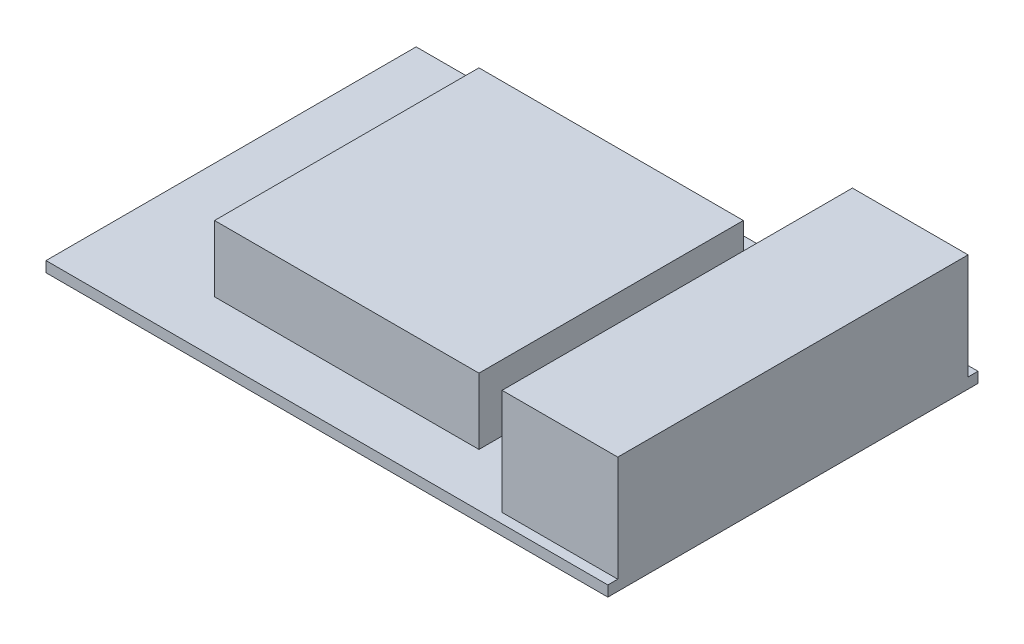
ISO-10303-21;
HEADER;
FILE_DESCRIPTION(('STEP AP214'),'2;1');
FILE_NAME('part.step','',(''),(''),'','','');
FILE_SCHEMA(('AUTOMOTIVE_DESIGN { 1 0 10303 214 1 1 1 1 }'));
ENDSEC;
DATA;
#1=APPLICATION_CONTEXT('core data for automotive mechanical design processes');
#2=APPLICATION_PROTOCOL_DEFINITION('international standard','automotive_design',2000,#1);
#3=PRODUCT_CONTEXT('',#1,'mechanical');
#4=PRODUCT('Part','Part','',(#3));
#5=PRODUCT_RELATED_PRODUCT_CATEGORY('part','',(#4));
#6=PRODUCT_DEFINITION_FORMATION('','',#4);
#7=PRODUCT_DEFINITION_CONTEXT('part definition',#1,'design');
#8=PRODUCT_DEFINITION('design','',#6,#7);
#9=PRODUCT_DEFINITION_SHAPE('','',#8);
#10=(LENGTH_UNIT() NAMED_UNIT(*) SI_UNIT(.MILLI.,.METRE.));
#11=(NAMED_UNIT(*) PLANE_ANGLE_UNIT() SI_UNIT($,.RADIAN.));
#12=(NAMED_UNIT(*) SI_UNIT($,.STERADIAN.) SOLID_ANGLE_UNIT());
#13=UNCERTAINTY_MEASURE_WITH_UNIT(LENGTH_MEASURE(1.E-05),#10,'distance_accuracy_value','');
#14=(GEOMETRIC_REPRESENTATION_CONTEXT(3) GLOBAL_UNCERTAINTY_ASSIGNED_CONTEXT((#13)) GLOBAL_UNIT_ASSIGNED_CONTEXT((#10,
#11,#12)) REPRESENTATION_CONTEXT('',''));
#15=CARTESIAN_POINT('',(0.,0.,0.));
#16=DIRECTION('',(0.,0.,1.));
#17=DIRECTION('',(1.,0.,0.));
#18=AXIS2_PLACEMENT_3D('',#15,#16,#17);
#19=CARTESIAN_POINT('',(-42.5,1.6,28.));
#20=DIRECTION('',(1.,0.,0.));
#21=DIRECTION('',(0.,0.,-1.));
#22=AXIS2_PLACEMENT_3D('',#19,#20,#21);
#23=PLANE('',#22);
#24=DIRECTION('',(0.,-1.,0.));
#25=VECTOR('',#24,1.);
#26=CARTESIAN_POINT('',(-42.5,1.6,-28.));
#27=LINE('',#26,#25);
#28=CARTESIAN_POINT('',(-42.5,1.6,-28.));
#29=VERTEX_POINT('',#28);
#30=CARTESIAN_POINT('',(-42.5,0.,-28.));
#31=VERTEX_POINT('',#30);
#32=EDGE_CURVE('E181',#29,#31,#27,.T.);
#33=ORIENTED_EDGE('',*,*,#32,.T.);
#34=DIRECTION('',(0.,0.,-1.));
#35=VECTOR('',#34,1.);
#36=CARTESIAN_POINT('',(-42.5,0.,28.));
#37=LINE('',#36,#35);
#38=CARTESIAN_POINT('',(-42.5,0.,28.));
#39=VERTEX_POINT('',#38);
#40=EDGE_CURVE('E11',#39,#31,#37,.T.);
#41=ORIENTED_EDGE('',*,*,#40,.F.);
#42=DIRECTION('',(0.,-1.,0.));
#43=VECTOR('',#42,1.);
#44=CARTESIAN_POINT('',(-42.5,1.6,28.));
#45=LINE('',#44,#43);
#46=CARTESIAN_POINT('',(-42.5,1.6,28.));
#47=VERTEX_POINT('',#46);
#48=EDGE_CURVE('E184',#47,#39,#45,.T.);
#49=ORIENTED_EDGE('',*,*,#48,.F.);
#50=DIRECTION('',(0.,0.,-1.));
#51=VECTOR('',#50,1.);
#52=CARTESIAN_POINT('',(-42.5,1.6,28.));
#53=LINE('',#52,#51);
#54=EDGE_CURVE('E194',#47,#29,#53,.T.);
#55=ORIENTED_EDGE('',*,*,#54,.T.);
#56=EDGE_LOOP('',(#33,#41,#49,#55));
#57=FACE_BOUND('',#56,.T.);
#58=ADVANCED_FACE('F39',(#57),#23,.F.);
#59=CARTESIAN_POINT('',(-42.5,0.,28.));
#60=DIRECTION('',(0.,1.,0.));
#61=DIRECTION('',(0.,0.,1.));
#62=AXIS2_PLACEMENT_3D('',#59,#60,#61);
#63=PLANE('',#62);
#64=DIRECTION('',(1.,0.,0.));
#65=VECTOR('',#64,1.);
#66=CARTESIAN_POINT('',(-42.5,0.,-28.));
#67=LINE('',#66,#65);
#68=CARTESIAN_POINT('',(42.5,0.,-28.));
#69=VERTEX_POINT('',#68);
#70=EDGE_CURVE('E197',#31,#69,#67,.T.);
#71=ORIENTED_EDGE('',*,*,#70,.T.);
#72=DIRECTION('',(0.,0.,-1.));
#73=VECTOR('',#72,1.);
#74=CARTESIAN_POINT('',(42.5,0.,28.));
#75=LINE('',#74,#73);
#76=CARTESIAN_POINT('',(42.5,0.,28.));
#77=VERTEX_POINT('',#76);
#78=EDGE_CURVE('E46',#77,#69,#75,.T.);
#79=ORIENTED_EDGE('',*,*,#78,.F.);
#80=DIRECTION('',(1.,0.,0.));
#81=VECTOR('',#80,1.);
#82=CARTESIAN_POINT('',(-42.5,0.,28.));
#83=LINE('',#82,#81);
#84=EDGE_CURVE('E190',#39,#77,#83,.T.);
#85=ORIENTED_EDGE('',*,*,#84,.F.);
#86=ORIENTED_EDGE('',*,*,#40,.T.);
#87=EDGE_LOOP('',(#71,#79,#85,#86));
#88=FACE_BOUND('',#87,.T.);
#89=ADVANCED_FACE('F248',(#88),#63,.F.);
#90=CARTESIAN_POINT('',(42.5,0.,28.));
#91=DIRECTION('',(-1.,0.,0.));
#92=DIRECTION('',(0.,0.,1.));
#93=AXIS2_PLACEMENT_3D('',#90,#91,#92);
#94=PLANE('',#93);
#95=DIRECTION('',(0.,1.,0.));
#96=VECTOR('',#95,1.);
#97=CARTESIAN_POINT('',(42.5,0.,-28.));
#98=LINE('',#97,#96);
#99=CARTESIAN_POINT('',(42.5,1.6,-28.));
#100=VERTEX_POINT('',#99);
#101=EDGE_CURVE('E200',#69,#100,#98,.T.);
#102=ORIENTED_EDGE('',*,*,#101,.T.);
#103=DIRECTION('',(0.,0.,-1.));
#104=VECTOR('',#103,1.);
#105=CARTESIAN_POINT('',(42.5,1.6,28.));
#106=LINE('',#105,#104);
#107=CARTESIAN_POINT('',(42.5,1.6,-26.5));
#108=VERTEX_POINT('',#107);
#109=EDGE_CURVE('E202',#108,#100,#106,.T.);
#110=ORIENTED_EDGE('',*,*,#109,.F.);
#111=DIRECTION('',(0.,1.,0.));
#112=VECTOR('',#111,1.);
#113=CARTESIAN_POINT('',(42.5,1.6,-26.5));
#114=LINE('',#113,#112);
#115=CARTESIAN_POINT('',(42.5,17.6,-26.5));
#116=VERTEX_POINT('',#115);
#117=EDGE_CURVE('E226',#108,#116,#114,.T.);
#118=ORIENTED_EDGE('',*,*,#117,.T.);
#119=DIRECTION('',(0.,0.,-1.));
#120=VECTOR('',#119,1.);
#121=CARTESIAN_POINT('',(42.5,17.6,26.5));
#122=LINE('',#121,#120);
#123=CARTESIAN_POINT('',(42.5,17.6,26.5));
#124=VERTEX_POINT('',#123);
#125=EDGE_CURVE('E149',#124,#116,#122,.T.);
#126=ORIENTED_EDGE('',*,*,#125,.F.);
#127=DIRECTION('',(0.,1.,0.));
#128=VECTOR('',#127,1.);
#129=CARTESIAN_POINT('',(42.5,1.6,26.5));
#130=LINE('',#129,#128);
#131=CARTESIAN_POINT('',(42.5,1.6,26.5));
#132=VERTEX_POINT('',#131);
#133=EDGE_CURVE('E135',#132,#124,#130,.T.);
#134=ORIENTED_EDGE('',*,*,#133,.F.);
#135=CARTESIAN_POINT('',(42.5,1.6,28.));
#136=VERTEX_POINT('',#135);
#137=EDGE_CURVE('E129',#136,#132,#106,.T.);
#138=ORIENTED_EDGE('',*,*,#137,.F.);
#139=DIRECTION('',(0.,1.,0.));
#140=VECTOR('',#139,1.);
#141=CARTESIAN_POINT('',(42.5,0.,28.));
#142=LINE('',#141,#140);
#143=EDGE_CURVE('E188',#77,#136,#142,.T.);
#144=ORIENTED_EDGE('',*,*,#143,.F.);
#145=ORIENTED_EDGE('',*,*,#78,.T.);
#146=EDGE_LOOP('',(#102,#110,#118,#126,#134,#138,#144,#145));
#147=FACE_BOUND('',#146,.T.);
#148=ADVANCED_FACE('F211',(#147),#94,.F.);
#149=CARTESIAN_POINT('',(42.5,1.6,28.));
#150=DIRECTION('',(0.,-1.,0.));
#151=DIRECTION('',(0.,0.,-1.));
#152=AXIS2_PLACEMENT_3D('',#149,#150,#151);
#153=PLANE('',#152);
#154=DIRECTION('',(0.,0.,-1.));
#155=VECTOR('',#154,1.);
#156=CARTESIAN_POINT('',(25.,1.6,26.5));
#157=LINE('',#156,#155);
#158=CARTESIAN_POINT('',(25.,1.6,26.5));
#159=VERTEX_POINT('',#158);
#160=CARTESIAN_POINT('',(25.,1.6,-26.5));
#161=VERTEX_POINT('',#160);
#162=EDGE_CURVE('E52',#159,#161,#157,.T.);
#163=ORIENTED_EDGE('',*,*,#162,.T.);
#164=DIRECTION('',(1.,0.,0.));
#165=VECTOR('',#164,1.);
#166=CARTESIAN_POINT('',(25.,1.6,-26.5));
#167=LINE('',#166,#165);
#168=EDGE_CURVE('E60',#161,#108,#167,.T.);
#169=ORIENTED_EDGE('',*,*,#168,.T.);
#170=ORIENTED_EDGE('',*,*,#109,.T.);
#171=DIRECTION('',(-1.,0.,0.));
#172=VECTOR('',#171,1.);
#173=CARTESIAN_POINT('',(42.5,1.6,-28.));
#174=LINE('',#173,#172);
#175=EDGE_CURVE('E189',#100,#29,#174,.T.);
#176=ORIENTED_EDGE('',*,*,#175,.T.);
#177=ORIENTED_EDGE('',*,*,#54,.F.);
#178=DIRECTION('',(-1.,0.,0.));
#179=VECTOR('',#178,1.);
#180=CARTESIAN_POINT('',(42.5,1.6,28.));
#181=LINE('',#180,#179);
#182=EDGE_CURVE('E195',#136,#47,#181,.T.);
#183=ORIENTED_EDGE('',*,*,#182,.F.);
#184=ORIENTED_EDGE('',*,*,#137,.T.);
#185=DIRECTION('',(1.,0.,0.));
#186=VECTOR('',#185,1.);
#187=CARTESIAN_POINT('',(25.,1.6,26.5));
#188=LINE('',#187,#186);
#189=EDGE_CURVE('E123',#159,#132,#188,.T.);
#190=ORIENTED_EDGE('',*,*,#189,.F.);
#191=EDGE_LOOP('',(#163,#169,#170,#176,#177,#183,#184,#190));
#192=FACE_BOUND('',#191,.T.);
#193=DIRECTION('',(0.,0.,-1.));
#194=VECTOR('',#193,1.);
#195=CARTESIAN_POINT('',(-25.,1.6,20.));
#196=LINE('',#195,#194);
#197=CARTESIAN_POINT('',(-25.,1.6,20.));
#198=VERTEX_POINT('',#197);
#199=CARTESIAN_POINT('',(-25.,1.6,-20.));
#200=VERTEX_POINT('',#199);
#201=EDGE_CURVE('E176',#198,#200,#196,.T.);
#202=ORIENTED_EDGE('',*,*,#201,.T.);
#203=DIRECTION('',(1.,0.,0.));
#204=VECTOR('',#203,1.);
#205=CARTESIAN_POINT('',(-25.,1.6,-20.));
#206=LINE('',#205,#204);
#207=CARTESIAN_POINT('',(15.,1.6,-20.));
#208=VERTEX_POINT('',#207);
#209=EDGE_CURVE('E151',#200,#208,#206,.T.);
#210=ORIENTED_EDGE('',*,*,#209,.T.);
#211=DIRECTION('',(0.,0.,-1.));
#212=VECTOR('',#211,1.);
#213=CARTESIAN_POINT('',(15.,1.6,20.));
#214=LINE('',#213,#212);
#215=CARTESIAN_POINT('',(15.,1.6,20.));
#216=VERTEX_POINT('',#215);
#217=EDGE_CURVE('E178',#216,#208,#214,.T.);
#218=ORIENTED_EDGE('',*,*,#217,.F.);
#219=DIRECTION('',(1.,0.,0.));
#220=VECTOR('',#219,1.);
#221=CARTESIAN_POINT('',(-25.,1.6,20.));
#222=LINE('',#221,#220);
#223=EDGE_CURVE('E159',#198,#216,#222,.T.);
#224=ORIENTED_EDGE('',*,*,#223,.F.);
#225=EDGE_LOOP('',(#202,#210,#218,#224));
#226=FACE_BOUND('',#225,.T.);
#227=ADVANCED_FACE('F121',(#192,#226),#153,.F.);
#228=CARTESIAN_POINT('',(0.,0.,28.));
#229=DIRECTION('',(0.,0.,1.));
#230=DIRECTION('',(1.,0.,0.));
#231=AXIS2_PLACEMENT_3D('',#228,#229,#230);
#232=PLANE('',#231);
#233=ORIENTED_EDGE('',*,*,#48,.T.);
#234=ORIENTED_EDGE('',*,*,#84,.T.);
#235=ORIENTED_EDGE('',*,*,#143,.T.);
#236=ORIENTED_EDGE('',*,*,#182,.T.);
#237=EDGE_LOOP('',(#233,#234,#235,#236));
#238=FACE_BOUND('',#237,.T.);
#239=ADVANCED_FACE('F225',(#238),#232,.T.);
#240=CARTESIAN_POINT('',(0.,0.,-28.));
#241=DIRECTION('',(0.,0.,1.));
#242=DIRECTION('',(1.,0.,0.));
#243=AXIS2_PLACEMENT_3D('',#240,#241,#242);
#244=PLANE('',#243);
#245=ORIENTED_EDGE('',*,*,#32,.F.);
#246=ORIENTED_EDGE('',*,*,#175,.F.);
#247=ORIENTED_EDGE('',*,*,#101,.F.);
#248=ORIENTED_EDGE('',*,*,#70,.F.);
#249=EDGE_LOOP('',(#245,#246,#247,#248));
#250=FACE_BOUND('',#249,.T.);
#251=ADVANCED_FACE('F216',(#250),#244,.F.);
#252=CARTESIAN_POINT('',(-25.,11.6,20.));
#253=DIRECTION('',(1.,0.,0.));
#254=DIRECTION('',(0.,0.,-1.));
#255=AXIS2_PLACEMENT_3D('',#252,#253,#254);
#256=PLANE('',#255);
#257=DIRECTION('',(0.,-1.,0.));
#258=VECTOR('',#257,1.);
#259=CARTESIAN_POINT('',(-25.,11.6,-20.));
#260=LINE('',#259,#258);
#261=CARTESIAN_POINT('',(-25.,11.6,-20.));
#262=VERTEX_POINT('',#261);
#263=EDGE_CURVE('E146',#262,#200,#260,.T.);
#264=ORIENTED_EDGE('',*,*,#263,.T.);
#265=ORIENTED_EDGE('',*,*,#201,.F.);
#266=DIRECTION('',(0.,-1.,0.));
#267=VECTOR('',#266,1.);
#268=CARTESIAN_POINT('',(-25.,11.6,20.));
#269=LINE('',#268,#267);
#270=CARTESIAN_POINT('',(-25.,11.6,20.));
#271=VERTEX_POINT('',#270);
#272=EDGE_CURVE('E158',#271,#198,#269,.T.);
#273=ORIENTED_EDGE('',*,*,#272,.F.);
#274=DIRECTION('',(0.,0.,-1.));
#275=VECTOR('',#274,1.);
#276=CARTESIAN_POINT('',(-25.,11.6,20.));
#277=LINE('',#276,#275);
#278=EDGE_CURVE('E167',#271,#262,#277,.T.);
#279=ORIENTED_EDGE('',*,*,#278,.T.);
#280=EDGE_LOOP('',(#264,#265,#273,#279));
#281=FACE_BOUND('',#280,.T.);
#282=ADVANCED_FACE('F265',(#281),#256,.F.);
#283=CARTESIAN_POINT('',(15.,1.6,20.));
#284=DIRECTION('',(-1.,0.,0.));
#285=DIRECTION('',(0.,0.,1.));
#286=AXIS2_PLACEMENT_3D('',#283,#284,#285);
#287=PLANE('',#286);
#288=DIRECTION('',(0.,1.,0.));
#289=VECTOR('',#288,1.);
#290=CARTESIAN_POINT('',(15.,1.6,-20.));
#291=LINE('',#290,#289);
#292=CARTESIAN_POINT('',(15.,11.6,-20.));
#293=VERTEX_POINT('',#292);
#294=EDGE_CURVE('E168',#208,#293,#291,.T.);
#295=ORIENTED_EDGE('',*,*,#294,.T.);
#296=DIRECTION('',(0.,0.,-1.));
#297=VECTOR('',#296,1.);
#298=CARTESIAN_POINT('',(15.,11.6,20.));
#299=LINE('',#298,#297);
#300=CARTESIAN_POINT('',(15.,11.6,20.));
#301=VERTEX_POINT('',#300);
#302=EDGE_CURVE('E173',#301,#293,#299,.T.);
#303=ORIENTED_EDGE('',*,*,#302,.F.);
#304=DIRECTION('',(0.,1.,0.));
#305=VECTOR('',#304,1.);
#306=CARTESIAN_POINT('',(15.,1.6,20.));
#307=LINE('',#306,#305);
#308=EDGE_CURVE('E162',#216,#301,#307,.T.);
#309=ORIENTED_EDGE('',*,*,#308,.F.);
#310=ORIENTED_EDGE('',*,*,#217,.T.);
#311=EDGE_LOOP('',(#295,#303,#309,#310));
#312=FACE_BOUND('',#311,.T.);
#313=ADVANCED_FACE('F266',(#312),#287,.F.);
#314=CARTESIAN_POINT('',(15.,11.6,20.));
#315=DIRECTION('',(0.,-1.,0.));
#316=DIRECTION('',(0.,0.,-1.));
#317=AXIS2_PLACEMENT_3D('',#314,#315,#316);
#318=PLANE('',#317);
#319=DIRECTION('',(-1.,0.,0.));
#320=VECTOR('',#319,1.);
#321=CARTESIAN_POINT('',(15.,11.6,-20.));
#322=LINE('',#321,#320);
#323=EDGE_CURVE('E161',#293,#262,#322,.T.);
#324=ORIENTED_EDGE('',*,*,#323,.T.);
#325=ORIENTED_EDGE('',*,*,#278,.F.);
#326=DIRECTION('',(-1.,0.,0.));
#327=VECTOR('',#326,1.);
#328=CARTESIAN_POINT('',(15.,11.6,20.));
#329=LINE('',#328,#327);
#330=EDGE_CURVE('E164',#301,#271,#329,.T.);
#331=ORIENTED_EDGE('',*,*,#330,.F.);
#332=ORIENTED_EDGE('',*,*,#302,.T.);
#333=EDGE_LOOP('',(#324,#325,#331,#332));
#334=FACE_BOUND('',#333,.T.);
#335=ADVANCED_FACE('F269',(#334),#318,.F.);
#336=CARTESIAN_POINT('',(0.,0.,20.));
#337=DIRECTION('',(0.,0.,1.));
#338=DIRECTION('',(1.,0.,0.));
#339=AXIS2_PLACEMENT_3D('',#336,#337,#338);
#340=PLANE('',#339);
#341=ORIENTED_EDGE('',*,*,#272,.T.);
#342=ORIENTED_EDGE('',*,*,#223,.T.);
#343=ORIENTED_EDGE('',*,*,#308,.T.);
#344=ORIENTED_EDGE('',*,*,#330,.T.);
#345=EDGE_LOOP('',(#341,#342,#343,#344));
#346=FACE_BOUND('',#345,.T.);
#347=ADVANCED_FACE('F273',(#346),#340,.T.);
#348=CARTESIAN_POINT('',(0.,0.,-20.));
#349=DIRECTION('',(0.,0.,1.));
#350=DIRECTION('',(1.,0.,0.));
#351=AXIS2_PLACEMENT_3D('',#348,#349,#350);
#352=PLANE('',#351);
#353=ORIENTED_EDGE('',*,*,#263,.F.);
#354=ORIENTED_EDGE('',*,*,#323,.F.);
#355=ORIENTED_EDGE('',*,*,#294,.F.);
#356=ORIENTED_EDGE('',*,*,#209,.F.);
#357=EDGE_LOOP('',(#353,#354,#355,#356));
#358=FACE_BOUND('',#357,.T.);
#359=ADVANCED_FACE('F241',(#358),#352,.F.);
#360=CARTESIAN_POINT('',(25.,17.6,26.5));
#361=DIRECTION('',(1.,0.,0.));
#362=DIRECTION('',(0.,0.,-1.));
#363=AXIS2_PLACEMENT_3D('',#360,#361,#362);
#364=PLANE('',#363);
#365=DIRECTION('',(0.,-1.,0.));
#366=VECTOR('',#365,1.);
#367=CARTESIAN_POINT('',(25.,17.6,-26.5));
#368=LINE('',#367,#366);
#369=CARTESIAN_POINT('',(25.,17.6,-26.5));
#370=VERTEX_POINT('',#369);
#371=EDGE_CURVE('E150',#370,#161,#368,.T.);
#372=ORIENTED_EDGE('',*,*,#371,.T.);
#373=ORIENTED_EDGE('',*,*,#162,.F.);
#374=DIRECTION('',(0.,-1.,0.));
#375=VECTOR('',#374,1.);
#376=CARTESIAN_POINT('',(25.,17.6,26.5));
#377=LINE('',#376,#375);
#378=CARTESIAN_POINT('',(25.,17.6,26.5));
#379=VERTEX_POINT('',#378);
#380=EDGE_CURVE('E134',#379,#159,#377,.T.);
#381=ORIENTED_EDGE('',*,*,#380,.F.);
#382=DIRECTION('',(0.,0.,-1.));
#383=VECTOR('',#382,1.);
#384=CARTESIAN_POINT('',(25.,17.6,26.5));
#385=LINE('',#384,#383);
#386=EDGE_CURVE('E152',#379,#370,#385,.T.);
#387=ORIENTED_EDGE('',*,*,#386,.T.);
#388=EDGE_LOOP('',(#372,#373,#381,#387));
#389=FACE_BOUND('',#388,.T.);
#390=ADVANCED_FACE('F144',(#389),#364,.F.);
#391=CARTESIAN_POINT('',(42.5,17.6,26.5));
#392=DIRECTION('',(0.,-1.,0.));
#393=DIRECTION('',(0.,0.,-1.));
#394=AXIS2_PLACEMENT_3D('',#391,#392,#393);
#395=PLANE('',#394);
#396=DIRECTION('',(-1.,0.,0.));
#397=VECTOR('',#396,1.);
#398=CARTESIAN_POINT('',(42.5,17.6,-26.5));
#399=LINE('',#398,#397);
#400=EDGE_CURVE('E142',#116,#370,#399,.T.);
#401=ORIENTED_EDGE('',*,*,#400,.T.);
#402=ORIENTED_EDGE('',*,*,#386,.F.);
#403=DIRECTION('',(-1.,0.,0.));
#404=VECTOR('',#403,1.);
#405=CARTESIAN_POINT('',(42.5,17.6,26.5));
#406=LINE('',#405,#404);
#407=EDGE_CURVE('E138',#124,#379,#406,.T.);
#408=ORIENTED_EDGE('',*,*,#407,.F.);
#409=ORIENTED_EDGE('',*,*,#125,.T.);
#410=EDGE_LOOP('',(#401,#402,#408,#409));
#411=FACE_BOUND('',#410,.T.);
#412=ADVANCED_FACE('F237',(#411),#395,.F.);
#413=CARTESIAN_POINT('',(0.,0.,26.5));
#414=DIRECTION('',(0.,0.,1.));
#415=DIRECTION('',(1.,0.,0.));
#416=AXIS2_PLACEMENT_3D('',#413,#414,#415);
#417=PLANE('',#416);
#418=ORIENTED_EDGE('',*,*,#380,.T.);
#419=ORIENTED_EDGE('',*,*,#189,.T.);
#420=ORIENTED_EDGE('',*,*,#133,.T.);
#421=ORIENTED_EDGE('',*,*,#407,.T.);
#422=EDGE_LOOP('',(#418,#419,#420,#421));
#423=FACE_BOUND('',#422,.T.);
#424=ADVANCED_FACE('F137',(#423),#417,.T.);
#425=CARTESIAN_POINT('',(0.,0.,-26.5));
#426=DIRECTION('',(0.,0.,1.));
#427=DIRECTION('',(1.,0.,0.));
#428=AXIS2_PLACEMENT_3D('',#425,#426,#427);
#429=PLANE('',#428);
#430=ORIENTED_EDGE('',*,*,#371,.F.);
#431=ORIENTED_EDGE('',*,*,#400,.F.);
#432=ORIENTED_EDGE('',*,*,#117,.F.);
#433=ORIENTED_EDGE('',*,*,#168,.F.);
#434=EDGE_LOOP('',(#430,#431,#432,#433));
#435=FACE_BOUND('',#434,.T.);
#436=ADVANCED_FACE('F234',(#435),#429,.F.);
#437=CLOSED_SHELL('',(#58,#89,#148,#227,#239,#251,#282,#313,#335,#347,#359,#390,#412,#424,#436));
#438=MANIFOLD_SOLID_BREP('B2',#437);
#439=ADVANCED_BREP_SHAPE_REPRESENTATION('',(#18,#438),#14);
#440=SHAPE_DEFINITION_REPRESENTATION(#9,#439);
ENDSEC;
END-ISO-10303-21;
